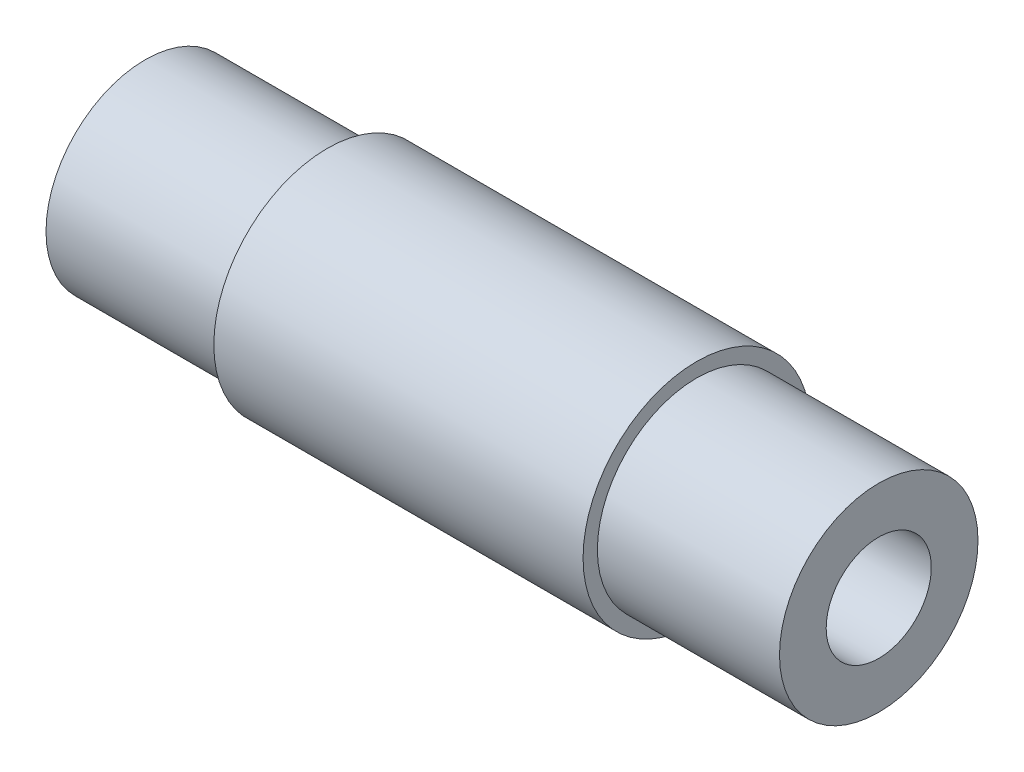
ISO-10303-21;
HEADER;
FILE_DESCRIPTION(('STEP AP214'),'2;1');
FILE_NAME('part.step','',(''),(''),'','','');
FILE_SCHEMA(('AUTOMOTIVE_DESIGN { 1 0 10303 214 1 1 1 1 }'));
ENDSEC;
DATA;
#1=APPLICATION_CONTEXT('core data for automotive mechanical design processes');
#2=APPLICATION_PROTOCOL_DEFINITION('international standard','automotive_design',2000,#1);
#3=PRODUCT_CONTEXT('',#1,'mechanical');
#4=PRODUCT('Part','Part','',(#3));
#5=PRODUCT_RELATED_PRODUCT_CATEGORY('part','',(#4));
#6=PRODUCT_DEFINITION_FORMATION('','',#4);
#7=PRODUCT_DEFINITION_CONTEXT('part definition',#1,'design');
#8=PRODUCT_DEFINITION('design','',#6,#7);
#9=PRODUCT_DEFINITION_SHAPE('','',#8);
#10=(LENGTH_UNIT() NAMED_UNIT(*) SI_UNIT(.MILLI.,.METRE.));
#11=(NAMED_UNIT(*) PLANE_ANGLE_UNIT() SI_UNIT($,.RADIAN.));
#12=(NAMED_UNIT(*) SI_UNIT($,.STERADIAN.) SOLID_ANGLE_UNIT());
#13=UNCERTAINTY_MEASURE_WITH_UNIT(LENGTH_MEASURE(1.E-05),#10,'distance_accuracy_value','');
#14=(GEOMETRIC_REPRESENTATION_CONTEXT(3) GLOBAL_UNCERTAINTY_ASSIGNED_CONTEXT((#13)) GLOBAL_UNIT_ASSIGNED_CONTEXT((#10,
#11,#12)) REPRESENTATION_CONTEXT('',''));
#15=CARTESIAN_POINT('',(0.,0.,0.));
#16=DIRECTION('',(0.,0.,1.));
#17=DIRECTION('',(1.,0.,0.));
#18=AXIS2_PLACEMENT_3D('',#15,#16,#17);
#19=CARTESIAN_POINT('',(-44.3,0.,0.));
#20=DIRECTION('',(1.,0.,0.));
#21=DIRECTION('',(0.,0.,-1.));
#22=AXIS2_PLACEMENT_3D('',#19,#20,#21);
#23=PLANE('',#22);
#24=CARTESIAN_POINT('',(-44.3,0.,0.));
#25=DIRECTION('',(1.,0.,0.));
#26=DIRECTION('',(0.,0.,-1.));
#27=AXIS2_PLACEMENT_3D('',#24,#25,#26);
#28=CIRCLE('',#27,6.35);
#29=CARTESIAN_POINT('',(-44.3,0.,-6.35));
#30=VERTEX_POINT('',#29);
#31=EDGE_CURVE('E53',#30,#30,#28,.F.);
#32=ORIENTED_EDGE('',*,*,#31,.F.);
#33=EDGE_LOOP('',(#32));
#34=FACE_BOUND('',#33,.T.);
#35=CARTESIAN_POINT('',(-44.3,0.,0.));
#36=DIRECTION('',(-1.,0.,0.));
#37=DIRECTION('',(0.,0.,1.));
#38=AXIS2_PLACEMENT_3D('',#35,#36,#37);
#39=CIRCLE('',#38,11.988);
#40=CARTESIAN_POINT('',(-44.3,0.,11.988));
#41=VERTEX_POINT('',#40);
#42=EDGE_CURVE('E10',#41,#41,#39,.T.);
#43=ORIENTED_EDGE('',*,*,#42,.T.);
#44=EDGE_LOOP('',(#43));
#45=FACE_BOUND('',#44,.T.);
#46=ADVANCED_FACE('F39',(#34,#45),#23,.F.);
#47=CARTESIAN_POINT('',(-1000.,0.,0.));
#48=DIRECTION('',(-1.,0.,0.));
#49=DIRECTION('',(0.,0.,1.));
#50=AXIS2_PLACEMENT_3D('',#47,#48,#49);
#51=CYLINDRICAL_SURFACE('',#50,11.988);
#52=ORIENTED_EDGE('',*,*,#42,.F.);
#53=EDGE_LOOP('',(#52));
#54=FACE_BOUND('',#53,.T.);
#55=CARTESIAN_POINT('',(-22.3,0.,0.));
#56=DIRECTION('',(-1.,0.,0.));
#57=DIRECTION('',(0.,0.,1.));
#58=AXIS2_PLACEMENT_3D('',#55,#56,#57);
#59=CIRCLE('',#58,11.988);
#60=CARTESIAN_POINT('',(-22.3,0.,11.988));
#61=VERTEX_POINT('',#60);
#62=EDGE_CURVE('E46',#61,#61,#59,.T.);
#63=ORIENTED_EDGE('',*,*,#62,.T.);
#64=EDGE_LOOP('',(#63));
#65=FACE_BOUND('',#64,.T.);
#66=ADVANCED_FACE('F114',(#54,#65),#51,.T.);
#67=CARTESIAN_POINT('',(-22.3,11.988,0.));
#68=DIRECTION('',(1.,0.,0.));
#69=DIRECTION('',(0.,0.,-1.));
#70=AXIS2_PLACEMENT_3D('',#67,#68,#69);
#71=PLANE('',#70);
#72=ORIENTED_EDGE('',*,*,#62,.F.);
#73=EDGE_LOOP('',(#72));
#74=FACE_BOUND('',#73,.T.);
#75=CARTESIAN_POINT('',(-22.3,0.,0.));
#76=DIRECTION('',(-1.,0.,0.));
#77=DIRECTION('',(0.,0.,1.));
#78=AXIS2_PLACEMENT_3D('',#75,#76,#77);
#79=CIRCLE('',#78,13.716);
#80=CARTESIAN_POINT('',(-22.3,0.,13.716));
#81=VERTEX_POINT('',#80);
#82=EDGE_CURVE('E51',#81,#81,#79,.T.);
#83=ORIENTED_EDGE('',*,*,#82,.T.);
#84=EDGE_LOOP('',(#83));
#85=FACE_BOUND('',#84,.T.);
#86=ADVANCED_FACE('F76',(#74,#85),#71,.F.);
#87=CARTESIAN_POINT('',(-1000.,0.,0.));
#88=DIRECTION('',(-1.,0.,0.));
#89=DIRECTION('',(0.,0.,1.));
#90=AXIS2_PLACEMENT_3D('',#87,#88,#89);
#91=CYLINDRICAL_SURFACE('',#90,13.716);
#92=ORIENTED_EDGE('',*,*,#82,.F.);
#93=EDGE_LOOP('',(#92));
#94=FACE_BOUND('',#93,.T.);
#95=CARTESIAN_POINT('',(22.3,0.,0.));
#96=DIRECTION('',(-1.,0.,0.));
#97=DIRECTION('',(0.,0.,1.));
#98=AXIS2_PLACEMENT_3D('',#95,#96,#97);
#99=CIRCLE('',#98,13.716);
#100=CARTESIAN_POINT('',(22.3,0.,13.716));
#101=VERTEX_POINT('',#100);
#102=EDGE_CURVE('E71',#101,#101,#99,.T.);
#103=ORIENTED_EDGE('',*,*,#102,.T.);
#104=EDGE_LOOP('',(#103));
#105=FACE_BOUND('',#104,.T.);
#106=ADVANCED_FACE('F77',(#94,#105),#91,.T.);
#107=CARTESIAN_POINT('',(22.3,13.716,0.));
#108=DIRECTION('',(-1.,0.,0.));
#109=DIRECTION('',(0.,0.,1.));
#110=AXIS2_PLACEMENT_3D('',#107,#108,#109);
#111=PLANE('',#110);
#112=ORIENTED_EDGE('',*,*,#102,.F.);
#113=EDGE_LOOP('',(#112));
#114=FACE_BOUND('',#113,.T.);
#115=CARTESIAN_POINT('',(22.3,0.,0.));
#116=DIRECTION('',(-1.,0.,0.));
#117=DIRECTION('',(0.,0.,1.));
#118=AXIS2_PLACEMENT_3D('',#115,#116,#117);
#119=CIRCLE('',#118,11.988);
#120=CARTESIAN_POINT('',(22.3,0.,11.988));
#121=VERTEX_POINT('',#120);
#122=EDGE_CURVE('E63',#121,#121,#119,.T.);
#123=ORIENTED_EDGE('',*,*,#122,.T.);
#124=EDGE_LOOP('',(#123));
#125=FACE_BOUND('',#124,.T.);
#126=ADVANCED_FACE('F84',(#114,#125),#111,.F.);
#127=CARTESIAN_POINT('',(-1000.,0.,0.));
#128=DIRECTION('',(-1.,0.,0.));
#129=DIRECTION('',(0.,0.,1.));
#130=AXIS2_PLACEMENT_3D('',#127,#128,#129);
#131=CYLINDRICAL_SURFACE('',#130,11.988);
#132=ORIENTED_EDGE('',*,*,#122,.F.);
#133=EDGE_LOOP('',(#132));
#134=FACE_BOUND('',#133,.T.);
#135=CARTESIAN_POINT('',(44.3,0.,0.));
#136=DIRECTION('',(-1.,0.,0.));
#137=DIRECTION('',(0.,0.,1.));
#138=AXIS2_PLACEMENT_3D('',#135,#136,#137);
#139=CIRCLE('',#138,11.988);
#140=CARTESIAN_POINT('',(44.3,0.,11.988));
#141=VERTEX_POINT('',#140);
#142=EDGE_CURVE('E57',#141,#141,#139,.T.);
#143=ORIENTED_EDGE('',*,*,#142,.T.);
#144=EDGE_LOOP('',(#143));
#145=FACE_BOUND('',#144,.T.);
#146=ADVANCED_FACE('F90',(#134,#145),#131,.T.);
#147=CARTESIAN_POINT('',(44.3,11.988,0.));
#148=DIRECTION('',(-1.,0.,0.));
#149=DIRECTION('',(0.,0.,1.));
#150=AXIS2_PLACEMENT_3D('',#147,#148,#149);
#151=PLANE('',#150);
#152=CARTESIAN_POINT('',(44.3,0.,0.));
#153=DIRECTION('',(-1.,0.,0.));
#154=DIRECTION('',(0.,0.,1.));
#155=AXIS2_PLACEMENT_3D('',#152,#153,#154);
#156=CIRCLE('',#155,6.35);
#157=CARTESIAN_POINT('',(44.3,0.,6.35));
#158=VERTEX_POINT('',#157);
#159=EDGE_CURVE('E45',#158,#158,#156,.F.);
#160=ORIENTED_EDGE('',*,*,#159,.F.);
#161=EDGE_LOOP('',(#160));
#162=FACE_BOUND('',#161,.T.);
#163=ORIENTED_EDGE('',*,*,#142,.F.);
#164=EDGE_LOOP('',(#163));
#165=FACE_BOUND('',#164,.T.);
#166=ADVANCED_FACE('F92',(#162,#165),#151,.F.);
#167=CARTESIAN_POINT('',(-1000.,0.,0.));
#168=DIRECTION('',(-1.,0.,0.));
#169=DIRECTION('',(0.,0.,1.));
#170=AXIS2_PLACEMENT_3D('',#167,#168,#169);
#171=CYLINDRICAL_SURFACE('',#170,6.35);
#172=CARTESIAN_POINT('',(-21.4,0.,0.));
#173=DIRECTION('',(-1.,0.,0.));
#174=DIRECTION('',(0.,0.,1.));
#175=AXIS2_PLACEMENT_3D('',#172,#173,#174);
#176=CIRCLE('',#175,6.35);
#177=CARTESIAN_POINT('',(-21.4,0.,6.35));
#178=VERTEX_POINT('',#177);
#179=EDGE_CURVE('E60',#178,#178,#176,.T.);
#180=ORIENTED_EDGE('',*,*,#179,.F.);
#181=EDGE_LOOP('',(#180));
#182=FACE_BOUND('',#181,.T.);
#183=ORIENTED_EDGE('',*,*,#31,.T.);
#184=EDGE_LOOP('',(#183));
#185=FACE_BOUND('',#184,.T.);
#186=ADVANCED_FACE('F99',(#182,#185),#171,.F.);
#187=CARTESIAN_POINT('',(-21.4,6.35,0.));
#188=DIRECTION('',(-1.,0.,0.));
#189=DIRECTION('',(0.,0.,1.));
#190=AXIS2_PLACEMENT_3D('',#187,#188,#189);
#191=PLANE('',#190);
#192=ORIENTED_EDGE('',*,*,#179,.T.);
#193=EDGE_LOOP('',(#192));
#194=FACE_BOUND('',#193,.T.);
#195=ADVANCED_FACE('F107',(#194),#191,.T.);
#196=CARTESIAN_POINT('',(-1000.,0.,0.));
#197=DIRECTION('',(-1.,0.,0.));
#198=DIRECTION('',(0.,0.,1.));
#199=AXIS2_PLACEMENT_3D('',#196,#197,#198);
#200=CYLINDRICAL_SURFACE('',#199,6.35);
#201=CARTESIAN_POINT('',(21.4000000000001,0.,0.));
#202=DIRECTION('',(-1.,0.,0.));
#203=DIRECTION('',(0.,0.,1.));
#204=AXIS2_PLACEMENT_3D('',#201,#202,#203);
#205=CIRCLE('',#204,6.35);
#206=CARTESIAN_POINT('',(21.4000000000001,0.,6.35));
#207=VERTEX_POINT('',#206);
#208=EDGE_CURVE('E69',#207,#207,#205,.T.);
#209=ORIENTED_EDGE('',*,*,#208,.T.);
#210=EDGE_LOOP('',(#209));
#211=FACE_BOUND('',#210,.T.);
#212=ORIENTED_EDGE('',*,*,#159,.T.);
#213=EDGE_LOOP('',(#212));
#214=FACE_BOUND('',#213,.T.);
#215=ADVANCED_FACE('F165',(#211,#214),#200,.F.);
#216=CARTESIAN_POINT('',(21.4,0.,0.));
#217=DIRECTION('',(1.,0.,0.));
#218=DIRECTION('',(0.,0.,-1.));
#219=AXIS2_PLACEMENT_3D('',#216,#217,#218);
#220=PLANE('',#219);
#221=ORIENTED_EDGE('',*,*,#208,.F.);
#222=EDGE_LOOP('',(#221));
#223=FACE_BOUND('',#222,.T.);
#224=ADVANCED_FACE('F168',(#223),#220,.T.);
#225=CLOSED_SHELL('',(#46,#66,#86,#106,#126,#146,#166,#186,#195,#215,#224));
#226=MANIFOLD_SOLID_BREP('B2',#225);
#227=ADVANCED_BREP_SHAPE_REPRESENTATION('',(#18,#226),#14);
#228=SHAPE_DEFINITION_REPRESENTATION(#9,#227);
ENDSEC;
END-ISO-10303-21;
